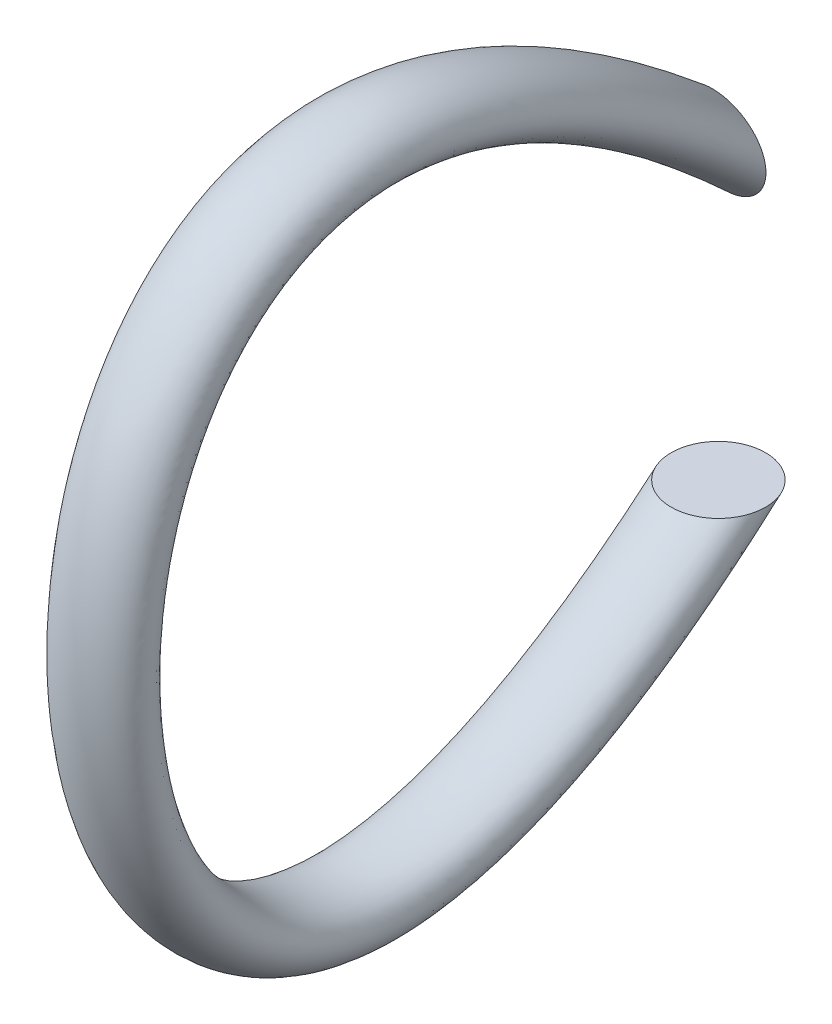
ISO-10303-21;
HEADER;
FILE_DESCRIPTION(('STEP AP214'),'2;1');
FILE_NAME('part.step','',(''),(''),'','','');
FILE_SCHEMA(('AUTOMOTIVE_DESIGN { 1 0 10303 214 1 1 1 1 }'));
ENDSEC;
DATA;
#1=APPLICATION_CONTEXT('core data for automotive mechanical design processes');
#2=APPLICATION_PROTOCOL_DEFINITION('international standard','automotive_design',2000,#1);
#3=PRODUCT_CONTEXT('',#1,'mechanical');
#4=PRODUCT('Part','Part','',(#3));
#5=PRODUCT_RELATED_PRODUCT_CATEGORY('part','',(#4));
#6=PRODUCT_DEFINITION_FORMATION('','',#4);
#7=PRODUCT_DEFINITION_CONTEXT('part definition',#1,'design');
#8=PRODUCT_DEFINITION('design','',#6,#7);
#9=PRODUCT_DEFINITION_SHAPE('','',#8);
#10=(LENGTH_UNIT() NAMED_UNIT(*) SI_UNIT(.MILLI.,.METRE.));
#11=(NAMED_UNIT(*) PLANE_ANGLE_UNIT() SI_UNIT($,.RADIAN.));
#12=(NAMED_UNIT(*) SI_UNIT($,.STERADIAN.) SOLID_ANGLE_UNIT());
#13=UNCERTAINTY_MEASURE_WITH_UNIT(LENGTH_MEASURE(1.E-05),#10,'distance_accuracy_value','');
#14=(GEOMETRIC_REPRESENTATION_CONTEXT(3) GLOBAL_UNCERTAINTY_ASSIGNED_CONTEXT((#13)) GLOBAL_UNIT_ASSIGNED_CONTEXT((#10,
#11,#12)) REPRESENTATION_CONTEXT('',''));
#15=CARTESIAN_POINT('',(0.,0.,0.));
#16=DIRECTION('',(0.,0.,1.));
#17=DIRECTION('',(1.,0.,0.));
#18=AXIS2_PLACEMENT_3D('',#15,#16,#17);
#19=CARTESIAN_POINT('',(0.001267385878935,50.,0.));
#20=DIRECTION('',(0.,0.127141568981043,-0.991884580703339));
#21=DIRECTION('',(-1.,0.,0.));
#22=AXIS2_PLACEMENT_3D('',#19,#20,#21);
#23=PLANE('',#22);
#24=CARTESIAN_POINT('',(8.,50.,0.));
#25=CARTESIAN_POINT('',(8.,36.815528345333,-1.690009548462));
#26=CARTESIAN_POINT('',(-8.43638552438501,34.922462603642,-1.93266615717));
#27=CARTESIAN_POINT('',(-21.99293536806,50.,0.));
#28=CARTESIAN_POINT('',(-8.43638552438501,65.077537396358,1.93266615717));
#29=CARTESIAN_POINT('',(8.,63.184471654667,1.690009548462));
#30=CARTESIAN_POINT('',(8.,50.,0.));
#31=(BOUNDED_CURVE() B_SPLINE_CURVE(6,(#24,#25,#26,#27,#28,#29,#30),.UNSPECIFIED.,.T.,
.F.) B_SPLINE_CURVE_WITH_KNOTS((7,7),(0.,6.28318530718),
.UNSPECIFIED.) CURVE() GEOMETRIC_REPRESENTATION_ITEM() RATIONAL_B_SPLINE_CURVE((1.669078461068,
1.03672962321,1.038346699848,0.853534330196,1.038346699848,1.03672962321,1.669078461068)) REPRESENTATION_ITEM(''));
#32=CARTESIAN_POINT('',(8.,50.,0.));
#33=VERTEX_POINT('',#32);
#34=EDGE_CURVE('E26',#33,#33,#31,.T.);
#35=ORIENTED_EDGE('',*,*,#34,.T.);
#36=EDGE_LOOP('',(#35));
#37=FACE_BOUND('',#36,.T.);
#38=ADVANCED_FACE('F16',(#37),#23,.T.);
#39=CARTESIAN_POINT('',(0.001267385878938,0.,0.));
#40=DIRECTION('',(0.,-1.,0.));
#41=DIRECTION('',(0.,0.,-1.));
#42=AXIS2_PLACEMENT_3D('',#39,#40,#41);
#43=PLANE('',#42);
#44=CARTESIAN_POINT('',(8.,0.,0.));
#45=CARTESIAN_POINT('',(8.,0.,13.292344604568));
#46=CARTESIAN_POINT('',(-8.43638552438501,0.,15.200899065965));
#47=CARTESIAN_POINT('',(-21.99293536806,0.,0.));
#48=CARTESIAN_POINT('',(-8.43638552438501,0.,-15.20089906596));
#49=CARTESIAN_POINT('',(8.,0.,-13.29234460456));
#50=CARTESIAN_POINT('',(8.,0.,0.));
#51=(BOUNDED_CURVE() B_SPLINE_CURVE(6,(#44,#45,#46,#47,#48,#49,#50),.UNSPECIFIED.,.T.,
.F.) B_SPLINE_CURVE_WITH_KNOTS((7,7),(0.,6.28318530718),
.UNSPECIFIED.) CURVE() GEOMETRIC_REPRESENTATION_ITEM() RATIONAL_B_SPLINE_CURVE((1.669078461068,
1.03672962321,1.038346699848,0.853534330196,1.038346699848,1.03672962321,1.669078461068)) REPRESENTATION_ITEM(''));
#52=CARTESIAN_POINT('',(8.,0.,0.));
#53=VERTEX_POINT('',#52);
#54=EDGE_CURVE('E10',#53,#53,#51,.T.);
#55=ORIENTED_EDGE('',*,*,#54,.F.);
#56=EDGE_LOOP('',(#55));
#57=FACE_BOUND('',#56,.T.);
#58=ADVANCED_FACE('F45',(#57),#43,.F.);
#59=CARTESIAN_POINT('',(8.,0.,0.));
#60=CARTESIAN_POINT('',(8.,-7.333333333334,8.33333333333299));
#61=CARTESIAN_POINT('',(8.,-13.55555555555,16.296296296298));
#62=CARTESIAN_POINT('',(8.,-18.72222222222,23.888888888885));
#63=CARTESIAN_POINT('',(8.,-22.88888888888,31.111111111119));
#64=CARTESIAN_POINT('',(8.,-26.11111111111,37.962962962954));
#65=CARTESIAN_POINT('',(8.,-28.44444444444,44.444444444452));
#66=CARTESIAN_POINT('',(8.,-29.94444444444,50.555555555552));
#67=CARTESIAN_POINT('',(8.,-30.66666666666,56.296296296297));
#68=CARTESIAN_POINT('',(8.,-30.66666666666,67.037037037036));
#69=CARTESIAN_POINT('',(8.,-28.,76.296296296297));
#70=CARTESIAN_POINT('',(8.,-26.05555555555,80.555555555554));
#71=CARTESIAN_POINT('',(8.,-23.55555555555,84.444444444449));
#72=CARTESIAN_POINT('',(8.,-20.55555555555,87.9629629629569));
#73=CARTESIAN_POINT('',(8.,-17.11111111111,91.1111111111172));
#74=CARTESIAN_POINT('',(8.,-13.27777777777,93.8888888888861));
#75=CARTESIAN_POINT('',(8.,-9.11111111111201,96.296296296297));
#76=CARTESIAN_POINT('',(8.,-0.222222222222,100.37037037036));
#77=CARTESIAN_POINT('',(8.,9.55555555555499,102.96296296296));
#78=CARTESIAN_POINT('',(8.,14.611111111111,103.88888888888));
#79=CARTESIAN_POINT('',(8.,19.777777777779,104.44444444445));
#80=CARTESIAN_POINT('',(8.,24.999999999997,104.62962962961));
#81=CARTESIAN_POINT('',(8.,30.222222222226,104.44444444445));
#82=CARTESIAN_POINT('',(8.,35.388888888886,103.88888888888));
#83=CARTESIAN_POINT('',(8.,40.444444444445,102.96296296296));
#84=CARTESIAN_POINT('',(8.,50.222222222221,100.37037037037));
#85=CARTESIAN_POINT('',(8.,59.111111111113,96.2962962962961));
#86=CARTESIAN_POINT('',(8.,63.277777777771,93.88888888889));
#87=CARTESIAN_POINT('',(8.,67.111111111124,91.1111111111079));
#88=CARTESIAN_POINT('',(8.,70.555555555539,87.962962962967));
#89=CARTESIAN_POINT('',(8.,73.5555555555691,84.444444444441));
#90=CARTESIAN_POINT('',(8.,76.0555555555489,80.555555555558));
#91=CARTESIAN_POINT('',(8.,78.000000000002,76.2962962962961));
#92=CARTESIAN_POINT('',(8.,80.666666666665,67.037037037037));
#93=CARTESIAN_POINT('',(8.,80.666666666668,56.296296296296));
#94=CARTESIAN_POINT('',(8.,79.944444444442,50.555555555555));
#95=CARTESIAN_POINT('',(8.,78.4444444444479,44.444444444445));
#96=CARTESIAN_POINT('',(8.,76.111111111107,37.962962962962));
#97=CARTESIAN_POINT('',(8.,72.888888888893,31.111111111113));
#98=CARTESIAN_POINT('',(8.,68.72222222222,23.888888888887));
#99=CARTESIAN_POINT('',(8.,63.5555555555571,16.296296296297));
#100=CARTESIAN_POINT('',(8.,57.333333333333,8.33333333333299));
#101=CARTESIAN_POINT('',(8.,50.,0.));
#102=CARTESIAN_POINT('',(8.,0.,13.292344604568));
#103=CARTESIAN_POINT('',(8.,-6.69808151724501,21.625677937903));
#104=CARTESIAN_POINT('',(8.,-12.20916894901,29.554908462978));
#105=CARTESIAN_POINT('',(8.,-16.57820243531,37.066176605336));
#106=CARTESIAN_POINT('',(8.,-19.84706469576,44.14204035845));
#107=CARTESIAN_POINT('',(8.,-22.06581343355,50.750951145571));
#108=CARTESIAN_POINT('',(8.,-23.28027155233,56.862353155495));
#109=CARTESIAN_POINT('',(8.,-23.55099701061,62.4212356268));
#110=CARTESIAN_POINT('',(8.,-22.98736967514,67.357085071168));
#111=CARTESIAN_POINT('',(8.,-20.51103536868,75.976127353969));
#112=CARTESIAN_POINT('',(8.,-15.8981955066,82.279886126428));
#113=CARTESIAN_POINT('',(8.,-13.198743975,84.901183370385));
#114=CARTESIAN_POINT('',(8.,-10.23287738651,87.085160137751));
#115=CARTESIAN_POINT('',(7.999999999999,-7.071545565514,88.994287097086));
#116=CARTESIAN_POINT('',(8.000000000001,-3.64172269275,90.685592159195));
#117=CARTESIAN_POINT('',(8.,0.03037379292874,92.150028574367));
#118=CARTESIAN_POINT('',(8.,3.942222064113,93.384974947909));
#119=CARTESIAN_POINT('',(8.,12.182105250872,95.35482967363));
#120=CARTESIAN_POINT('',(8.,21.097043233898,96.251374245364));
#121=CARTESIAN_POINT('',(7.999999999999,25.683738231044,96.412460403419));
#122=CARTESIAN_POINT('',(8.000000000001,30.348450097164,96.2672964997271));
#123=CARTESIAN_POINT('',(7.999999999999,35.033546709425,95.800108525326));
#124=CARTESIAN_POINT('',(8.000000000001,39.676981046598,94.999212982668));
#125=CARTESIAN_POINT('',(7.999999999999,44.2124342071231,93.856685628763));
#126=CARTESIAN_POINT('',(8.,48.568968657255,92.36846121635));
#127=CARTESIAN_POINT('',(8.,56.774165360292,88.704392929285));
#128=CARTESIAN_POINT('',(8.,63.65842712638,83.719046357051));
#129=CARTESIAN_POINT('',(8.,66.694545782684,80.90981997687));
#130=CARTESIAN_POINT('',(7.999999999999,69.245695975041,77.805133574612));
#131=CARTESIAN_POINT('',(8.000000000001,71.246979235501,74.457257199252));
#132=CARTESIAN_POINT('',(7.999999999999,72.630136582783,70.894140658422));
#133=CARTESIAN_POINT('',(8.,73.379829528997,67.250572453219));
#134=CARTESIAN_POINT('',(8.,73.60361192103,63.531940021473));
#135=CARTESIAN_POINT('',(8.,73.0913237130061,55.827292977106));
#136=CARTESIAN_POINT('',(8.,70.671998698629,47.273033980755));
#137=CARTESIAN_POINT('',(8.,68.987932280154,42.705372447121));
#138=CARTESIAN_POINT('',(8.,66.783893313361,37.743348583682));
#139=CARTESIAN_POINT('',(8.,63.941228308292,32.324609690598));
#140=CARTESIAN_POINT('',(8.,60.350453396686,26.437199806948));
#141=CARTESIAN_POINT('',(8.,55.924467760429,20.086887686352));
#142=CARTESIAN_POINT('',(8.,50.575724291504,13.275115428221));
#143=CARTESIAN_POINT('',(8.,44.229628591263,6.013227303628));
#144=CARTESIAN_POINT('',(8.,36.815528345333,-1.690009548462));
#145=CARTESIAN_POINT('',(-8.43638552438501,0.,15.200899065965));
#146=CARTESIAN_POINT('',(-8.43638552438501,-6.606870167873,23.534232399299));
#147=CARTESIAN_POINT('',(-8.436385524385,-12.0158507466,31.458619520391));
#148=CARTESIAN_POINT('',(-8.43638552438501,-16.27035768322,38.958210855761));
#149=CARTESIAN_POINT('',(-8.436385524385,-19.41031051074,46.013060023605));
#150=CARTESIAN_POINT('',(-8.43638552438501,-21.48497753441,52.58708860847));
#151=CARTESIAN_POINT('',(-8.436385524385,-22.53878421462,58.645353504698));
#152=CARTESIAN_POINT('',(-8.43638552438501,-22.63300676988,64.1249453417671));
#153=CARTESIAN_POINT('',(-8.436385524385,-21.88475332192,68.945226094504));
#154=CARTESIAN_POINT('',(-8.43638552438501,-19.05285955406,77.259628588157));
#155=CARTESIAN_POINT('',(-8.436385524385,-14.16058234324,83.139027790686));
#156=CARTESIAN_POINT('',(-8.43638552438501,-11.35272464348,85.525141565897));
#157=CARTESIAN_POINT('',(-8.436385524385,-8.319967541515,87.464321968685));
#158=CARTESIAN_POINT('',(-8.436385524386,-5.135471216739,89.14236769054));
#159=CARTESIAN_POINT('',(-8.436385524384,-1.707747752818,90.624494879645));
#160=CARTESIAN_POINT('',(-8.436385524386,1.94119786564,91.900357827055));
#161=CARTESIAN_POINT('',(-8.436385524385,5.816458552017,92.966958750365));
#162=CARTESIAN_POINT('',(-8.43638552438501,13.963155565445,94.634683389598));
#163=CARTESIAN_POINT('',(-8.436385524385,22.754204438708,95.287704330754));
#164=CARTESIAN_POINT('',(-8.436385524386,27.273579039253,95.338972515037));
#165=CARTESIAN_POINT('',(-8.436385524384,31.866218738838,95.093197222604));
#166=CARTESIAN_POINT('',(-8.436385524387,36.474193254904,94.532339565311));
#167=CARTESIAN_POINT('',(-8.436385524384,41.034523502237,93.643038494143));
#168=CARTESIAN_POINT('',(-8.436385524386,45.479345145971,92.416231979742));
#169=CARTESIAN_POINT('',(-8.43638552438501,49.7355120620771,90.847271074482));
#170=CARTESIAN_POINT('',(-8.43638552438501,57.714912886705,87.029357113251));
#171=CARTESIAN_POINT('',(-8.436385524385,64.311344314921,81.913167319323));
#172=CARTESIAN_POINT('',(-8.43638552438501,67.185135517849,79.0462465732511));
#173=CARTESIAN_POINT('',(-8.436385524386,69.552186032785,75.8946216562109));
#174=CARTESIAN_POINT('',(-8.43638552438501,71.346255908516,72.518067706618));
#175=CARTESIAN_POINT('',(-8.436385524386,72.497262168109,68.948547648805));
#176=CARTESIAN_POINT('',(-8.43638552438501,72.99564081004,65.340203318639));
#177=CARTESIAN_POINT('',(-8.436385524385,72.972365415486,61.699195698338));
#178=CARTESIAN_POINT('',(-8.43638552438501,72.003633390422,54.21776450992));
#179=CARTESIAN_POINT('',(-8.436385524385,69.236934478733,45.977447080099));
#180=CARTESIAN_POINT('',(-8.436385524384,67.414763603396,41.578219755847));
#181=CARTESIAN_POINT('',(-8.436385524388,65.109636623104,36.781185264734));
#182=CARTESIAN_POINT('',(-8.436385524382,62.193840258315,31.515038120422));
#183=CARTESIAN_POINT('',(-8.436385524388,58.550147452981,25.766105689455));
#184=CARTESIAN_POINT('',(-8.436385524383,54.086928026044,19.540985020334));
#185=CARTESIAN_POINT('',(-8.436385524386,48.712041427112,12.841325273358));
#186=CARTESIAN_POINT('',(-8.43638552438501,42.348159603639,5.680099563894));
#187=CARTESIAN_POINT('',(-8.43638552438501,34.922462603642,-1.93266615717));
#188=CARTESIAN_POINT('',(-21.99293536806,0.,0.));
#189=CARTESIAN_POINT('',(-21.99293536806,-7.333333333333,8.33333333333401));
#190=CARTESIAN_POINT('',(-21.99293536806,-13.55555555555,16.296296296295));
#191=CARTESIAN_POINT('',(-21.99293536806,-18.72222222221,23.88888888889));
#192=CARTESIAN_POINT('',(-21.99293536807,-22.88888888889,31.111111111111));
#193=CARTESIAN_POINT('',(-21.99293536806,-26.11111111109,37.962962962961));
#194=CARTESIAN_POINT('',(-21.99293536807,-28.44444444445,44.444444444448));
#195=CARTESIAN_POINT('',(-21.99293536806,-29.94444444443,50.555555555554));
#196=CARTESIAN_POINT('',(-21.99293536806,-30.66666666666,56.296296296297));
#197=CARTESIAN_POINT('',(-21.99293536806,-30.66666666666,67.037037037037));
#198=CARTESIAN_POINT('',(-21.99293536806,-28.,76.2962962962961));
#199=CARTESIAN_POINT('',(-21.99293536806,-26.05555555555,80.555555555555));
#200=CARTESIAN_POINT('',(-21.99293536806,-23.55555555556,84.4444444444461));
#201=CARTESIAN_POINT('',(-21.99293536806,-20.55555555555,87.962962962961));
#202=CARTESIAN_POINT('',(-21.99293536806,-17.11111111111,91.111111111113));
#203=CARTESIAN_POINT('',(-21.99293536806,-13.27777777777,93.888888888888));
#204=CARTESIAN_POINT('',(-21.99293536806,-9.11111111111201,96.296296296297));
#205=CARTESIAN_POINT('',(-21.99293536806,-0.222222222222,100.37037037037));
#206=CARTESIAN_POINT('',(-21.99293536806,9.555555555556,102.96296296296));
#207=CARTESIAN_POINT('',(-21.99293536806,14.611111111111,103.88888888888));
#208=CARTESIAN_POINT('',(-21.99293536806,19.777777777779,104.44444444444));
#209=CARTESIAN_POINT('',(-21.99293536807,24.999999999998,104.62962962962));
#210=CARTESIAN_POINT('',(-21.99293536806,30.222222222224,104.44444444444));
#211=CARTESIAN_POINT('',(-21.99293536806,35.388888888888,103.88888888888));
#212=CARTESIAN_POINT('',(-21.99293536806,40.444444444445,102.96296296296));
#213=CARTESIAN_POINT('',(-21.99293536806,50.222222222222,100.37037037037));
#214=CARTESIAN_POINT('',(-21.99293536806,59.111111111112,96.296296296297));
#215=CARTESIAN_POINT('',(-21.99293536806,63.277777777773,93.888888888887));
#216=CARTESIAN_POINT('',(-21.99293536806,67.111111111121,91.111111111114));
#217=CARTESIAN_POINT('',(-21.99293536806,70.5555555555431,87.96296296296));
#218=CARTESIAN_POINT('',(-21.99293536806,73.555555555567,84.4444444444461));
#219=CARTESIAN_POINT('',(-21.99293536806,76.055555555549,80.555555555555));
#220=CARTESIAN_POINT('',(-21.99293536806,78.000000000002,76.296296296297));
#221=CARTESIAN_POINT('',(-21.99293536806,80.666666666665,67.037037037037));
#222=CARTESIAN_POINT('',(-21.99293536806,80.666666666667,56.296296296296));
#223=CARTESIAN_POINT('',(-21.99293536806,79.944444444443,50.555555555556));
#224=CARTESIAN_POINT('',(-21.99293536806,78.444444444447,44.444444444444));
#225=CARTESIAN_POINT('',(-21.99293536806,76.1111111111069,37.962962962965));
#226=CARTESIAN_POINT('',(-21.99293536806,72.888888888894,31.111111111109));
#227=CARTESIAN_POINT('',(-21.99293536806,68.722222222218,23.88888888889));
#228=CARTESIAN_POINT('',(-21.99293536806,63.555555555558,16.296296296296));
#229=CARTESIAN_POINT('',(-21.99293536806,57.333333333333,8.333333333333));
#230=CARTESIAN_POINT('',(-21.99293536806,50.,0.));
#231=CARTESIAN_POINT('',(-8.43638552438501,0.,-15.20089906596));
#232=CARTESIAN_POINT('',(-8.43638552438501,-8.05979649879501,-6.867565732631));
#233=CARTESIAN_POINT('',(-8.436385524386,-15.0952603645,1.133973072199));
#234=CARTESIAN_POINT('',(-8.436385524384,-21.17408676121,8.819566922018));
#235=CARTESIAN_POINT('',(-8.436385524387,-26.36746726703,16.209162198619));
#236=CARTESIAN_POINT('',(-8.436385524383,-30.73724468779,23.33883731745));
#237=CARTESIAN_POINT('',(-8.436385524387,-34.35010467427,30.243535384197));
#238=CARTESIAN_POINT('',(-8.436385524384,-37.255882119,36.986165769341));
#239=CARTESIAN_POINT('',(-8.436385524385,-39.44858001141,43.647366498089));
#240=CARTESIAN_POINT('',(-8.43638552438501,-42.28047377926,56.814445485917));
#241=CARTESIAN_POINT('',(-8.436385524385,-41.83941765675,69.453564801907));
#242=CARTESIAN_POINT('',(-8.43638552438501,-40.75838646762,75.5859695452131));
#243=CARTESIAN_POINT('',(-8.436385524385,-38.7911435696,81.424566920207));
#244=CARTESIAN_POINT('',(-8.43638552438501,-35.97563989436,86.783558235381));
#245=CARTESIAN_POINT('',(-8.436385524385,-32.5144744694,91.5977273425819));
#246=CARTESIAN_POINT('',(-8.43638552438501,-28.49675342119,95.877419950722));
#247=CARTESIAN_POINT('',(-8.436385524385,-24.03868077423,99.625633842228));
#248=CARTESIAN_POINT('',(-8.43638552438501,-14.40760000989,106.10605735114));
#249=CARTESIAN_POINT('',(-8.436385524385,-3.643093327596,110.63822159517));
#250=CARTESIAN_POINT('',(-8.436385524386,1.948643182967,112.43880526274));
#251=CARTESIAN_POINT('',(-8.436385524384,7.689336816723,113.79569166628));
#252=CARTESIAN_POINT('',(-8.436385524387,13.52580674509,114.72691969395));
#253=CARTESIAN_POINT('',(-8.436385524383,19.409920942211,115.24585039473));
#254=CARTESIAN_POINT('',(-8.436385524386,25.298432631806,115.36154579804));
#255=CARTESIAN_POINT('',(-8.43638552438501,31.153376826812,115.07865485144));
#256=CARTESIAN_POINT('',(-8.43638552438501,42.72953155774,113.71138362749));
#257=CARTESIAN_POINT('',(-8.436385524385,53.910877907301,110.67942527327));
#258=CARTESIAN_POINT('',(-8.43638552438501,59.370420037704,108.73153120452));
#259=CARTESIAN_POINT('',(-8.436385524386,64.670036189445,106.32760056601));
#260=CARTESIAN_POINT('',(-8.436385524384,69.764855202584,103.4078582193));
#261=CARTESIAN_POINT('',(-8.436385524386,74.613848943013,99.9403412400849));
#262=CARTESIAN_POINT('',(-8.43638552438501,79.115470301065,95.770907792471));
#263=CARTESIAN_POINT('',(-8.436385524385,83.027634584516,90.8933968942549));
#264=CARTESIAN_POINT('',(-8.43638552438501,89.329699942909,79.8563095641531));
#265=CARTESIAN_POINT('',(-8.436385524385,92.096398854604,66.615145512494));
#266=CARTESIAN_POINT('',(-8.436385524384,92.474125285483,59.532891355264));
#267=CARTESIAN_POINT('',(-8.436385524387,91.779252265802,52.107703624152));
#268=CARTESIAN_POINT('',(-8.436385524383,90.028381963888,44.41088780551));
#269=CARTESIAN_POINT('',(-8.436385524387,87.227630324813,36.45611653276));
#270=CARTESIAN_POINT('',(-8.436385524384,83.357516418392,28.236792757449));
#271=CARTESIAN_POINT('',(-8.436385524386,78.399069684003,19.751267319232));
#272=CARTESIAN_POINT('',(-8.43638552438501,72.318507063027,10.986567102773));
#273=CARTESIAN_POINT('',(-8.43638552438501,65.077537396358,1.93266615717));
#274=CARTESIAN_POINT('',(8.,0.,-13.29234460456));
#275=CARTESIAN_POINT('',(8.,-7.968585149422,-4.95901127123501));
#276=CARTESIAN_POINT('',(8.,-14.90194216209,3.037684129614));
#277=CARTESIAN_POINT('',(8.,-20.86624200912,10.711601172439));
#278=CARTESIAN_POINT('',(8.,-25.93071308202,18.080181863782));
#279=CARTESIAN_POINT('',(8.,-30.15640878865,25.17497478034));
#280=CARTESIAN_POINT('',(8.,-33.60861733657,32.026535733407));
#281=CARTESIAN_POINT('',(8.,-36.33789187826,38.689875484304));
#282=CARTESIAN_POINT('',(8.,-38.34596365819,45.235507521426));
#283=CARTESIAN_POINT('',(8.,-40.82229796464,58.097946720104));
#284=CARTESIAN_POINT('',(8.,-40.10180449339,70.312706466166));
#285=CARTESIAN_POINT('',(8.,-38.91236713609,76.209927740722));
#286=CARTESIAN_POINT('',(8.000000000001,-36.87823372459,81.803728751147));
#287=CARTESIAN_POINT('',(7.999999999999,-34.03956554558,86.931638828827));
#288=CARTESIAN_POINT('',(8.000000000001,-30.58049952947,91.536630063039));
#289=CARTESIAN_POINT('',(8.,-26.58592934848,95.627749203403));
#290=CARTESIAN_POINT('',(8.,-22.16444428633,99.2076176446859));
#291=CARTESIAN_POINT('',(8.,-12.62654969531,105.3859110671));
#292=CARTESIAN_POINT('',(8.,-1.985932122787,109.67455168056));
#293=CARTESIAN_POINT('',(8.,3.538483991177,111.36531737435));
#294=CARTESIAN_POINT('',(8.000000000001,9.207105458394,112.62159238917));
#295=CARTESIAN_POINT('',(7.999999999999,14.966453290571,113.45915073392));
#296=CARTESIAN_POINT('',(8.000000000001,20.76746339785,113.88967590622));
#297=CARTESIAN_POINT('',(7.999999999999,26.565343570653,113.92109214901));
#298=CARTESIAN_POINT('',(8.,32.319920231634,113.55746470957));
#299=CARTESIAN_POINT('',(8.,43.670279084153,112.03634781145));
#300=CARTESIAN_POINT('',(8.,54.563795095842,108.87354623554));
#301=CARTESIAN_POINT('',(8.,59.861009772873,106.86795780091));
#302=CARTESIAN_POINT('',(8.,64.976526247178,104.4170886476));
#303=CARTESIAN_POINT('',(8.,69.864131875615,101.46866872667));
#304=CARTESIAN_POINT('',(8.,74.480974528322,97.9947482304619));
#305=CARTESIAN_POINT('',(8.,78.731281582118,93.8605386578931));
#306=CARTESIAN_POINT('',(8.,82.396388078968,89.06065257112));
#307=CARTESIAN_POINT('',(8.,88.2420096203281,78.246781096968));
#308=CARTESIAN_POINT('',(8.,90.661334634703,65.319558611838));
#309=CARTESIAN_POINT('',(8.,90.9009566087389,58.405738663989));
#310=CARTESIAN_POINT('',(8.000000000001,90.104995575518,51.14554030521));
#311=CARTESIAN_POINT('',(7.999999999999,88.2809939139459,43.601316235322));
#312=CARTESIAN_POINT('',(8.000000000001,85.427324381074,35.785022415283));
#313=CARTESIAN_POINT('',(7.999999999999,81.519976684029,27.690890091417));
#314=CARTESIAN_POINT('',(8.,76.535386819601,19.317477164378));
#315=CARTESIAN_POINT('',(8.,70.437038075405,10.653439363036));
#316=CARTESIAN_POINT('',(8.,63.184471654667,1.690009548462));
#317=CARTESIAN_POINT('',(8.,0.,0.));
#318=CARTESIAN_POINT('',(8.,-7.333333333334,8.33333333333299));
#319=CARTESIAN_POINT('',(8.,-13.55555555555,16.296296296298));
#320=CARTESIAN_POINT('',(8.,-18.72222222222,23.888888888885));
#321=CARTESIAN_POINT('',(8.,-22.88888888888,31.111111111119));
#322=CARTESIAN_POINT('',(8.,-26.11111111111,37.962962962954));
#323=CARTESIAN_POINT('',(8.,-28.44444444444,44.444444444452));
#324=CARTESIAN_POINT('',(8.,-29.94444444444,50.555555555552));
#325=CARTESIAN_POINT('',(8.,-30.66666666666,56.296296296297));
#326=CARTESIAN_POINT('',(8.,-30.66666666666,67.037037037036));
#327=CARTESIAN_POINT('',(8.,-28.,76.296296296297));
#328=CARTESIAN_POINT('',(8.,-26.05555555555,80.555555555554));
#329=CARTESIAN_POINT('',(8.,-23.55555555555,84.444444444449));
#330=CARTESIAN_POINT('',(8.,-20.55555555555,87.9629629629569));
#331=CARTESIAN_POINT('',(8.,-17.11111111111,91.1111111111172));
#332=CARTESIAN_POINT('',(8.,-13.27777777777,93.8888888888861));
#333=CARTESIAN_POINT('',(8.,-9.11111111111201,96.296296296297));
#334=CARTESIAN_POINT('',(8.,-0.222222222222,100.37037037036));
#335=CARTESIAN_POINT('',(8.,9.55555555555499,102.96296296296));
#336=CARTESIAN_POINT('',(8.,14.611111111111,103.88888888888));
#337=CARTESIAN_POINT('',(8.,19.777777777779,104.44444444445));
#338=CARTESIAN_POINT('',(8.,24.999999999997,104.62962962961));
#339=CARTESIAN_POINT('',(8.,30.222222222226,104.44444444445));
#340=CARTESIAN_POINT('',(8.,35.388888888886,103.88888888888));
#341=CARTESIAN_POINT('',(8.,40.444444444445,102.96296296296));
#342=CARTESIAN_POINT('',(8.,50.222222222221,100.37037037037));
#343=CARTESIAN_POINT('',(8.,59.111111111113,96.2962962962961));
#344=CARTESIAN_POINT('',(8.,63.277777777771,93.88888888889));
#345=CARTESIAN_POINT('',(8.,67.111111111124,91.1111111111079));
#346=CARTESIAN_POINT('',(8.,70.555555555539,87.962962962967));
#347=CARTESIAN_POINT('',(8.,73.5555555555691,84.444444444441));
#348=CARTESIAN_POINT('',(8.,76.0555555555489,80.555555555558));
#349=CARTESIAN_POINT('',(8.,78.000000000002,76.2962962962961));
#350=CARTESIAN_POINT('',(8.,80.666666666665,67.037037037037));
#351=CARTESIAN_POINT('',(8.,80.666666666668,56.296296296296));
#352=CARTESIAN_POINT('',(8.,79.944444444442,50.555555555555));
#353=CARTESIAN_POINT('',(8.,78.4444444444479,44.444444444445));
#354=CARTESIAN_POINT('',(8.,76.111111111107,37.962962962962));
#355=CARTESIAN_POINT('',(8.,72.888888888893,31.111111111113));
#356=CARTESIAN_POINT('',(8.,68.72222222222,23.888888888887));
#357=CARTESIAN_POINT('',(8.,63.5555555555571,16.296296296297));
#358=CARTESIAN_POINT('',(8.,57.333333333333,8.33333333333299));
#359=CARTESIAN_POINT('',(8.,50.,0.));
#360=(BOUNDED_SURFACE() B_SPLINE_SURFACE(6,10,((#59,#60,#61,#62,#63,#64,#65,#66,#67,#68,#69,#70,
#71,#72,#73,#74,#75,#76,#77,#78,#79,#80,#81,#82,#83,#84,#85,#86,#87,#88,#89,#90,#91,#92,#93,#94,
#95,#96,#97,#98,#99,#100,#101),(#102,#103,#104,#105,#106,#107,#108,#109,#110,#111,#112,#113,
#114,#115,#116,#117,#118,#119,#120,#121,#122,#123,#124,#125,#126,#127,#128,#129,#130,#131,#132,
#133,#134,#135,#136,#137,#138,#139,#140,#141,#142,#143,#144),(#145,#146,#147,#148,#149,#150,
#151,#152,#153,#154,#155,#156,#157,#158,#159,#160,#161,#162,#163,#164,#165,#166,#167,#168,#169,
#170,#171,#172,#173,#174,#175,#176,#177,#178,#179,#180,#181,#182,#183,#184,#185,#186,#187),
(#188,#189,#190,#191,#192,#193,#194,#195,#196,#197,#198,#199,#200,#201,#202,#203,#204,#205,#206,
#207,#208,#209,#210,#211,#212,#213,#214,#215,#216,#217,#218,#219,#220,#221,#222,#223,#224,#225,
#226,#227,#228,#229,#230),(#231,#232,#233,#234,#235,#236,#237,#238,#239,#240,#241,#242,#243,
#244,#245,#246,#247,#248,#249,#250,#251,#252,#253,#254,#255,#256,#257,#258,#259,#260,#261,#262,
#263,#264,#265,#266,#267,#268,#269,#270,#271,#272,#273),(#274,#275,#276,#277,#278,#279,#280,
#281,#282,#283,#284,#285,#286,#287,#288,#289,#290,#291,#292,#293,#294,#295,#296,#297,#298,#299,
#300,#301,#302,#303,#304,#305,#306,#307,#308,#309,#310,#311,#312,#313,#314,#315,#316),(#317,
#318,#319,#320,#321,#322,#323,#324,#325,#326,#327,#328,#329,#330,#331,#332,#333,#334,#335,#336,
#337,#338,#339,#340,#341,#342,#343,#344,#345,#346,#347,#348,#349,#350,#351,#352,#353,#354,#355,
#356,#357,#358,#359)),.UNSPECIFIED.,.T.,.F.,.F.) B_SPLINE_SURFACE_WITH_KNOTS((7,7),(11,8,8,8,8,
11),(0.,6.28318530718),(0.,50.,100.,150.,200.,250.),
.UNSPECIFIED.) GEOMETRIC_REPRESENTATION_ITEM() RATIONAL_B_SPLINE_SURFACE(((1.669078461068,
1.669078461068,1.669078461068,1.669078461069,1.669078461068,1.669078461069,1.669078461068,
1.669078461068,1.669078461068,1.669078461068,1.669078461068,1.669078461069,1.669078461068,
1.669078461069,1.669078461068,1.669078461068,1.669078461068,1.669078461068,1.669078461068,
1.669078461069,1.669078461068,1.669078461069,1.669078461068,1.669078461068,1.669078461068,
1.669078461068,1.669078461068,1.669078461068,1.669078461068,1.669078461069,1.669078461068,
1.669078461068,1.669078461068,1.669078461068,1.669078461068,1.669078461068,1.669078461068,
1.669078461068,1.669078461068,1.669078461068,1.669078461068,1.669078461068,1.669078461068),
(1.03672962321,1.03672962321,1.036729623209,1.03672962321,1.036729623209,1.03672962321,
1.036729623209,1.03672962321,1.03672962321,1.03672962321,1.03672962321,1.03672962321,
1.036729623209,1.03672962321,1.036729623209,1.03672962321,1.03672962321,1.03672962321,
1.03672962321,1.03672962321,1.036729623209,1.03672962321,1.036729623209,1.03672962321,
1.03672962321,1.03672962321,1.03672962321,1.03672962321,1.03672962321,1.03672962321,
1.03672962321,1.03672962321,1.03672962321,1.03672962321,1.03672962321,1.03672962321,
1.03672962321,1.03672962321,1.03672962321,1.036729623209,1.03672962321,1.03672962321,
1.03672962321),(1.038346699848,1.038346699848,1.038346699847,1.038346699848,1.038346699847,
1.038346699848,1.038346699847,1.038346699848,1.038346699847,1.038346699848,1.038346699847,
1.038346699848,1.038346699847,1.038346699848,1.038346699847,1.038346699848,1.038346699847,
1.038346699848,1.038346699847,1.038346699848,1.038346699847,1.038346699848,1.038346699847,
1.038346699847,1.038346699848,1.038346699848,1.038346699847,1.038346699848,1.038346699847,
1.038346699848,1.038346699847,1.038346699848,1.038346699847,1.038346699848,1.038346699847,
1.038346699848,1.038346699847,1.038346699848,1.038346699847,1.038346699848,1.038346699847,
1.038346699848,1.038346699848),(0.853534330196,0.853534330196,0.853534330196,0.853534330196,
0.853534330196,0.853534330196,0.853534330196,0.853534330196,0.853534330196,0.853534330196,
0.853534330196,0.853534330196,0.853534330196,0.853534330196,0.853534330196,0.853534330196,
0.853534330196,0.853534330196,0.853534330196,0.853534330196,0.853534330196,0.853534330196,
0.853534330196,0.853534330196,0.853534330196,0.853534330196,0.853534330196,0.853534330196,
0.853534330196,0.853534330196,0.853534330196,0.853534330196,0.853534330196,0.853534330196,
0.853534330196,0.853534330196,0.853534330196,0.853534330196,0.853534330196,0.853534330196,
0.853534330196,0.853534330196,0.853534330196),(1.038346699848,1.038346699848,1.038346699847,
1.038346699848,1.038346699847,1.038346699848,1.038346699847,1.038346699848,1.038346699847,
1.038346699848,1.038346699847,1.038346699848,1.038346699847,1.038346699848,1.038346699847,
1.038346699848,1.038346699847,1.038346699848,1.038346699847,1.038346699848,1.038346699848,
1.038346699847,1.038346699848,1.038346699847,1.038346699848,1.038346699848,1.038346699847,
1.038346699848,1.038346699847,1.038346699848,1.038346699847,1.038346699848,1.038346699847,
1.038346699848,1.038346699847,1.038346699848,1.038346699847,1.038346699848,1.038346699847,
1.038346699848,1.038346699847,1.038346699848,1.038346699848),(1.03672962321,1.03672962321,
1.03672962321,1.03672962321,1.036729623209,1.03672962321,1.036729623209,1.03672962321,
1.03672962321,1.03672962321,1.03672962321,1.03672962321,1.036729623209,1.03672962321,
1.036729623209,1.03672962321,1.03672962321,1.03672962321,1.03672962321,1.03672962321,
1.03672962321,1.03672962321,1.03672962321,1.03672962321,1.03672962321,1.03672962321,
1.03672962321,1.03672962321,1.03672962321,1.03672962321,1.03672962321,1.03672962321,
1.03672962321,1.03672962321,1.03672962321,1.03672962321,1.03672962321,1.03672962321,
1.03672962321,1.03672962321,1.03672962321,1.03672962321,1.03672962321),(1.669078461068,
1.669078461068,1.669078461068,1.669078461069,1.669078461068,1.669078461069,1.669078461068,
1.669078461068,1.669078461068,1.669078461068,1.669078461068,1.669078461069,1.669078461068,
1.669078461069,1.669078461068,1.669078461068,1.669078461068,1.669078461068,1.669078461068,
1.669078461069,1.669078461068,1.669078461069,1.669078461068,1.669078461068,1.669078461068,
1.669078461068,1.669078461068,1.669078461068,1.669078461068,1.669078461069,1.669078461068,
1.669078461068,1.669078461068,1.669078461068,1.669078461068,1.669078461068,1.669078461068,
1.669078461068,1.669078461068,1.669078461068,1.669078461068,1.669078461068,1.669078461068))) REPRESENTATION_ITEM('') SURFACE());
#361=CARTESIAN_POINT('',(8.,0.,0.));
#362=CARTESIAN_POINT('',(8.,-7.333333333334,8.33333333333299));
#363=CARTESIAN_POINT('',(8.,-13.55555555555,16.296296296298));
#364=CARTESIAN_POINT('',(8.,-18.72222222222,23.888888888885));
#365=CARTESIAN_POINT('',(8.,-22.88888888888,31.111111111119));
#366=CARTESIAN_POINT('',(8.,-26.11111111111,37.962962962954));
#367=CARTESIAN_POINT('',(8.,-28.44444444444,44.444444444452));
#368=CARTESIAN_POINT('',(8.,-29.94444444444,50.555555555552));
#369=CARTESIAN_POINT('',(8.,-30.66666666666,56.296296296297));
#370=CARTESIAN_POINT('',(8.,-30.66666666666,67.037037037036));
#371=CARTESIAN_POINT('',(8.,-28.,76.296296296297));
#372=CARTESIAN_POINT('',(8.,-26.05555555555,80.555555555554));
#373=CARTESIAN_POINT('',(8.,-23.55555555555,84.444444444449));
#374=CARTESIAN_POINT('',(8.,-20.55555555555,87.9629629629569));
#375=CARTESIAN_POINT('',(8.,-17.11111111111,91.1111111111172));
#376=CARTESIAN_POINT('',(8.,-13.27777777777,93.8888888888861));
#377=CARTESIAN_POINT('',(8.,-9.11111111111201,96.296296296297));
#378=CARTESIAN_POINT('',(8.,-0.222222222222,100.37037037036));
#379=CARTESIAN_POINT('',(8.,9.55555555555499,102.96296296296));
#380=CARTESIAN_POINT('',(8.,14.611111111111,103.88888888888));
#381=CARTESIAN_POINT('',(8.,19.777777777779,104.44444444445));
#382=CARTESIAN_POINT('',(8.,24.999999999997,104.62962962961));
#383=CARTESIAN_POINT('',(8.,30.222222222226,104.44444444445));
#384=CARTESIAN_POINT('',(8.,35.388888888886,103.88888888888));
#385=CARTESIAN_POINT('',(8.,40.444444444445,102.96296296296));
#386=CARTESIAN_POINT('',(8.,50.222222222221,100.37037037037));
#387=CARTESIAN_POINT('',(8.,59.111111111113,96.2962962962961));
#388=CARTESIAN_POINT('',(8.,63.277777777771,93.88888888889));
#389=CARTESIAN_POINT('',(8.,67.111111111124,91.1111111111079));
#390=CARTESIAN_POINT('',(8.,70.555555555539,87.962962962967));
#391=CARTESIAN_POINT('',(8.,73.5555555555691,84.444444444441));
#392=CARTESIAN_POINT('',(8.,76.0555555555489,80.555555555558));
#393=CARTESIAN_POINT('',(8.,78.000000000002,76.2962962962961));
#394=CARTESIAN_POINT('',(8.,80.666666666665,67.037037037037));
#395=CARTESIAN_POINT('',(8.,80.666666666668,56.296296296296));
#396=CARTESIAN_POINT('',(8.,79.944444444442,50.555555555555));
#397=CARTESIAN_POINT('',(8.,78.4444444444479,44.444444444445));
#398=CARTESIAN_POINT('',(8.,76.111111111107,37.962962962962));
#399=CARTESIAN_POINT('',(8.,72.888888888893,31.111111111113));
#400=CARTESIAN_POINT('',(8.,68.72222222222,23.888888888887));
#401=CARTESIAN_POINT('',(8.,63.5555555555571,16.296296296297));
#402=CARTESIAN_POINT('',(8.,57.333333333333,8.33333333333299));
#403=CARTESIAN_POINT('',(8.,50.,0.));
#404=(BOUNDED_CURVE() B_SPLINE_CURVE(10,(#361,#362,#363,#364,#365,#366,#367,#368,#369,#370,#371,
#372,#373,#374,#375,#376,#377,#378,#379,#380,#381,#382,#383,#384,#385,#386,#387,#388,#389,#390,
#391,#392,#393,#394,#395,#396,#397,#398,#399,#400,#401,#402,#403),.UNSPECIFIED.,.F.,
.F.) B_SPLINE_CURVE_WITH_KNOTS((11,8,8,8,8,11),(0.,50.,100.,150.,200.,250.),
.UNSPECIFIED.) CURVE() GEOMETRIC_REPRESENTATION_ITEM() RATIONAL_B_SPLINE_CURVE((1.669078461068,
1.669078461068,1.669078461068,1.669078461069,1.669078461068,1.669078461069,1.669078461068,
1.669078461068,1.669078461068,1.669078461068,1.669078461068,1.669078461069,1.669078461068,
1.669078461069,1.669078461068,1.669078461068,1.669078461068,1.669078461068,1.669078461068,
1.669078461069,1.669078461068,1.669078461069,1.669078461068,1.669078461068,1.669078461068,
1.669078461068,1.669078461068,1.669078461068,1.669078461068,1.669078461069,1.669078461068,
1.669078461068,1.669078461068,1.669078461068,1.669078461068,1.669078461068,1.669078461068,
1.669078461068,1.669078461068,1.669078461068,1.669078461068,1.669078461068,1.669078461068)) REPRESENTATION_ITEM(''));
#405=EDGE_CURVE('E43',#53,#33,#404,.T.);
#406=ORIENTED_EDGE('',*,*,#405,.T.);
#407=ORIENTED_EDGE('',*,*,#34,.F.);
#408=ORIENTED_EDGE('',*,*,#405,.F.);
#409=ORIENTED_EDGE('',*,*,#54,.T.);
#410=EDGE_LOOP('',(#406,#407,#408,#409));
#411=FACE_BOUND('',#410,.T.);
#412=ADVANCED_FACE('F42',(#411),#360,.T.);
#413=CLOSED_SHELL('',(#38,#58,#412));
#414=MANIFOLD_SOLID_BREP('B1',#413);
#415=ADVANCED_BREP_SHAPE_REPRESENTATION('',(#18,#414),#14);
#416=SHAPE_DEFINITION_REPRESENTATION(#9,#415);
ENDSEC;
END-ISO-10303-21;
